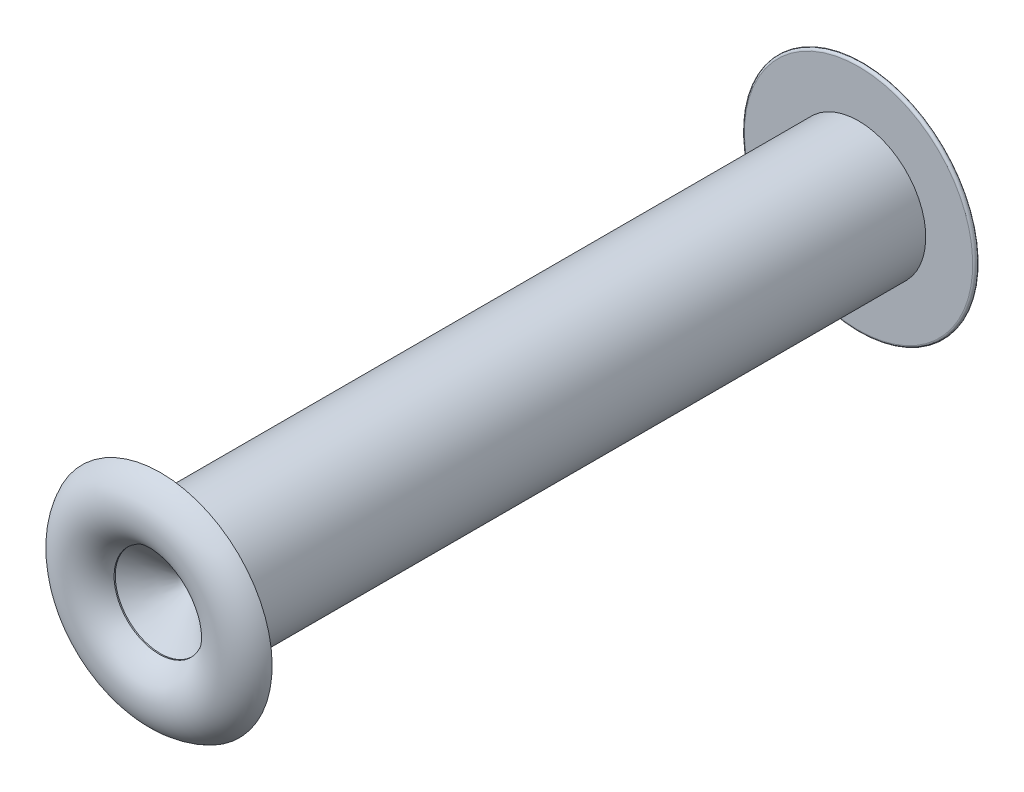
ISO-10303-21;
HEADER;
FILE_DESCRIPTION(('STEP AP214'),'2;1');
FILE_NAME('part.step','',(''),(''),'','','');
FILE_SCHEMA(('AUTOMOTIVE_DESIGN { 1 0 10303 214 1 1 1 1 }'));
ENDSEC;
DATA;
#1=APPLICATION_CONTEXT('core data for automotive mechanical design processes');
#2=APPLICATION_PROTOCOL_DEFINITION('international standard','automotive_design',2000,#1);
#3=PRODUCT_CONTEXT('',#1,'mechanical');
#4=PRODUCT('Part','Part','',(#3));
#5=PRODUCT_RELATED_PRODUCT_CATEGORY('part','',(#4));
#6=PRODUCT_DEFINITION_FORMATION('','',#4);
#7=PRODUCT_DEFINITION_CONTEXT('part definition',#1,'design');
#8=PRODUCT_DEFINITION('design','',#6,#7);
#9=PRODUCT_DEFINITION_SHAPE('','',#8);
#10=(LENGTH_UNIT() NAMED_UNIT(*) SI_UNIT(.MILLI.,.METRE.));
#11=(NAMED_UNIT(*) PLANE_ANGLE_UNIT() SI_UNIT($,.RADIAN.));
#12=(NAMED_UNIT(*) SI_UNIT($,.STERADIAN.) SOLID_ANGLE_UNIT());
#13=UNCERTAINTY_MEASURE_WITH_UNIT(LENGTH_MEASURE(1.E-05),#10,'distance_accuracy_value','');
#14=(GEOMETRIC_REPRESENTATION_CONTEXT(3) GLOBAL_UNCERTAINTY_ASSIGNED_CONTEXT((#13)) GLOBAL_UNIT_ASSIGNED_CONTEXT((#10,
#11,#12)) REPRESENTATION_CONTEXT('',''));
#15=CARTESIAN_POINT('',(0.,0.,0.));
#16=DIRECTION('',(0.,0.,1.));
#17=DIRECTION('',(1.,0.,0.));
#18=AXIS2_PLACEMENT_3D('',#15,#16,#17);
#19=CARTESIAN_POINT('',(12.4968,8.50900000000002,7.98190000102749));
#20=DIRECTION('',(0.,0.,1.));
#21=DIRECTION('',(0.,-1.,0.));
#22=AXIS2_PLACEMENT_3D('',#19,#20,#21);
#23=CONICAL_SURFACE('',#22,1.02452697329119,0.872664624946351);
#24=CARTESIAN_POINT('',(12.4967999999512,8.50900000000365,7.12221979381411));
#25=VERTEX_POINT('',#24);
#26=VERTEX_LOOP('',#25);
#27=FACE_BOUND('',#26,.T.);
#28=CARTESIAN_POINT('',(12.4968,8.50900000000002,7.98190000000431));
#29=DIRECTION('',(0.,0.,1.));
#30=DIRECTION('',(0.503184724324304,-0.864178878014659,0.));
#31=AXIS2_PLACEMENT_3D('',#28,#29,#30);
#32=CIRCLE('',#31,1.02452697414936);
#33=CARTESIAN_POINT('',(13.0123263230502,7.62362542898387,7.98190000000432));
#34=VERTEX_POINT('',#33);
#35=EDGE_CURVE('E33',#34,#34,#32,.T.);
#36=ORIENTED_EDGE('',*,*,#35,.T.);
#37=EDGE_LOOP('',(#36));
#38=FACE_BOUND('',#37,.T.);
#39=ADVANCED_FACE('F17',(#27,#38),#23,.F.);
#40=CARTESIAN_POINT('',(12.4968,8.50900000000002,8.0072999998606));
#41=DIRECTION('',(0.,0.,1.));
#42=DIRECTION('',(0.,-1.,0.));
#43=AXIS2_PLACEMENT_3D('',#40,#41,#42);
#44=CONICAL_SURFACE('',#43,1.02585813173476,0.052359877521599);
#45=ORIENTED_EDGE('',*,*,#35,.F.);
#46=EDGE_LOOP('',(#45));
#47=FACE_BOUND('',#46,.T.);
#48=CARTESIAN_POINT('',(12.4968,8.50900000000002,8.00730000000094));
#49=DIRECTION('',(0.,0.,-1.));
#50=DIRECTION('',(-0.503184724324108,0.864178878014773,0.));
#51=AXIS2_PLACEMENT_3D('',#48,#49,#50);
#52=CIRCLE('',#51,1.02585813174655);
#53=CARTESIAN_POINT('',(11.9806038587815,9.39552492929508,8.00730000000093));
#54=VERTEX_POINT('',#53);
#55=EDGE_CURVE('E35',#54,#54,#52,.T.);
#56=ORIENTED_EDGE('',*,*,#55,.F.);
#57=EDGE_LOOP('',(#56));
#58=FACE_BOUND('',#57,.T.);
#59=ADVANCED_FACE('F30',(#47,#58),#44,.F.);
#60=CARTESIAN_POINT('',(12.4968,8.50899999999999,-3.92659705882259));
#61=DIRECTION('',(-0.864178878014773,-0.503184724324108,0.));
#62=DIRECTION('',(-0.503184724324108,0.864178878014773,0.));
#63=AXIS2_PLACEMENT_3D('',#60,#61,#62);
#64=SPHERICAL_SURFACE('',#63,4.86970294117647);
#65=CARTESIAN_POINT('',(12.4968,8.50899999999997,-8.02626713432975));
#66=DIRECTION('',(0.,0.,-1.));
#67=DIRECTION('',(-0.503184724324108,0.864178878014773,0.));
#68=AXIS2_PLACEMENT_3D('',#65,#66,#67);
#69=CIRCLE('',#68,2.6280624055174);
#70=CARTESIAN_POINT('',(11.1743991429732,10.7801160209528,-8.02626713432976));
#71=VERTEX_POINT('',#70);
#72=EDGE_CURVE('E20',#71,#71,#69,.F.);
#73=ORIENTED_EDGE('',*,*,#72,.F.);
#74=EDGE_LOOP('',(#73));
#75=FACE_BOUND('',#74,.T.);
#76=ADVANCED_FACE('F60',(#75),#64,.T.);
#77=CARTESIAN_POINT('',(12.4968,8.50900000000002,7.62841744712827));
#78=DIRECTION('',(0.,0.,-1.));
#79=DIRECTION('',(-0.503184724324108,0.864178878014773,0.));
#80=AXIS2_PLACEMENT_3D('',#77,#78,#79);
#81=TOROIDAL_SURFACE('',#80,1.77446496492317,0.839025732352735);
#82=ORIENTED_EDGE('',*,*,#55,.T.);
#83=EDGE_LOOP('',(#82));
#84=FACE_BOUND('',#83,.T.);
#85=CARTESIAN_POINT('',(12.4968,8.50900000000002,7.97181268533049));
#86=DIRECTION('',(0.,0.,-1.));
#87=DIRECTION('',(0.,1.,0.));
#88=AXIS2_PLACEMENT_3D('',#85,#86,#87);
#89=CIRCLE('',#88,2.54);
#90=CARTESIAN_POINT('',(12.4968,11.049,7.97181268533048));
#91=VERTEX_POINT('',#90);
#92=EDGE_CURVE('E50',#91,#91,#89,.F.);
#93=ORIENTED_EDGE('',*,*,#92,.T.);
#94=EDGE_LOOP('',(#93));
#95=FACE_BOUND('',#94,.T.);
#96=ADVANCED_FACE('F62',(#84,#95),#81,.T.);
#97=CARTESIAN_POINT('',(12.4968,8.50899999999997,-7.98349999999906));
#98=DIRECTION('',(0.,0.,-1.));
#99=DIRECTION('',(-0.503184724324108,0.864178878014773,0.));
#100=AXIS2_PLACEMENT_3D('',#97,#98,#99);
#101=TOROIDAL_SURFACE('',#100,2.60064685844752,0.0508);
#102=CARTESIAN_POINT('',(12.4968,8.50899999999997,-7.93269999999906));
#103=DIRECTION('',(0.,0.,-1.));
#104=DIRECTION('',(-0.503184724324108,0.864178878014773,0.));
#105=AXIS2_PLACEMENT_3D('',#102,#103,#104);
#106=CIRCLE('',#105,2.60064685844754);
#107=CARTESIAN_POINT('',(11.1881942274677,10.7564240842458,-7.93269999999907));
#108=VERTEX_POINT('',#107);
#109=EDGE_CURVE('E49',#108,#108,#106,.T.);
#110=ORIENTED_EDGE('',*,*,#109,.T.);
#111=EDGE_LOOP('',(#110));
#112=FACE_BOUND('',#111,.T.);
#113=ORIENTED_EDGE('',*,*,#72,.T.);
#114=EDGE_LOOP('',(#113));
#115=FACE_BOUND('',#114,.T.);
#116=ADVANCED_FACE('F58',(#112,#115),#101,.T.);
#117=CARTESIAN_POINT('',(14.2825359042659,9.54877897581566,7.97181268533049));
#118=DIRECTION('',(0.,0.,1.));
#119=DIRECTION('',(0.,-1.,0.));
#120=AXIS2_PLACEMENT_3D('',#117,#118,#119);
#121=PLANE('',#120);
#122=ORIENTED_EDGE('',*,*,#92,.F.);
#123=EDGE_LOOP('',(#122));
#124=FACE_BOUND('',#123,.T.);
#125=CARTESIAN_POINT('',(12.4968,8.50900000000002,7.97181268533049));
#126=DIRECTION('',(0.,0.,-1.));
#127=DIRECTION('',(0.,1.,0.));
#128=AXIS2_PLACEMENT_3D('',#125,#126,#127);
#129=CIRCLE('',#128,2.06639614748302);
#130=CARTESIAN_POINT('',(12.4968,10.575396147483,7.97181268533048));
#131=VERTEX_POINT('',#130);
#132=EDGE_CURVE('E47',#131,#131,#129,.F.);
#133=ORIENTED_EDGE('',*,*,#132,.T.);
#134=EDGE_LOOP('',(#133));
#135=FACE_BOUND('',#134,.T.);
#136=ADVANCED_FACE('F108',(#124,#135),#121,.F.);
#137=CARTESIAN_POINT('',(11.1743038540301,7.73895125713057,-7.93269999999906));
#138=DIRECTION('',(0.,0.,-1.));
#139=DIRECTION('',(0.,1.,0.));
#140=AXIS2_PLACEMENT_3D('',#137,#138,#139);
#141=PLANE('',#140);
#142=CARTESIAN_POINT('',(12.4968,8.50899999999997,-7.93269999999906));
#143=DIRECTION('',(0.,0.,-1.));
#144=DIRECTION('',(0.,1.,0.));
#145=AXIS2_PLACEMENT_3D('',#142,#143,#144);
#146=CIRCLE('',#145,1.53035);
#147=CARTESIAN_POINT('',(12.4968,10.03935,-7.93269999999907));
#148=VERTEX_POINT('',#147);
#149=EDGE_CURVE('E24',#148,#148,#146,.F.);
#150=ORIENTED_EDGE('',*,*,#149,.F.);
#151=EDGE_LOOP('',(#150));
#152=FACE_BOUND('',#151,.T.);
#153=ORIENTED_EDGE('',*,*,#109,.F.);
#154=EDGE_LOOP('',(#153));
#155=FACE_BOUND('',#154,.T.);
#156=ADVANCED_FACE('F79',(#152,#155),#141,.F.);
#157=CARTESIAN_POINT('',(12.4968,8.50900000000002,7.62841744712827));
#158=DIRECTION('',(0.,0.,-1.));
#159=DIRECTION('',(-0.503184724324108,0.864178878014773,0.));
#160=AXIS2_PLACEMENT_3D('',#157,#158,#159);
#161=TOROIDAL_SURFACE('',#160,1.77446496492317,0.450715103996694);
#162=ORIENTED_EDGE('',*,*,#132,.F.);
#163=EDGE_LOOP('',(#162));
#164=FACE_BOUND('',#163,.T.);
#165=CARTESIAN_POINT('',(12.4968,8.50900000000002,8.00730000000094));
#166=DIRECTION('',(0.,0.,-1.));
#167=DIRECTION('',(0.,1.,0.));
#168=AXIS2_PLACEMENT_3D('',#165,#166,#167);
#169=CIRCLE('',#168,1.53035);
#170=CARTESIAN_POINT('',(12.4968,10.03935,8.00730000000093));
#171=VERTEX_POINT('',#170);
#172=EDGE_CURVE('E11',#171,#171,#169,.T.);
#173=ORIENTED_EDGE('',*,*,#172,.F.);
#174=EDGE_LOOP('',(#173));
#175=FACE_BOUND('',#174,.T.);
#176=ADVANCED_FACE('F73',(#164,#175),#161,.F.);
#177=CARTESIAN_POINT('',(12.4968,8.50899999999997,-8.49629999999906));
#178=DIRECTION('',(0.,0.,-1.));
#179=DIRECTION('',(0.,1.,0.));
#180=AXIS2_PLACEMENT_3D('',#177,#178,#179);
#181=CYLINDRICAL_SURFACE('',#180,1.53035);
#182=ORIENTED_EDGE('',*,*,#172,.T.);
#183=EDGE_LOOP('',(#182));
#184=FACE_BOUND('',#183,.T.);
#185=ORIENTED_EDGE('',*,*,#149,.T.);
#186=EDGE_LOOP('',(#185));
#187=FACE_BOUND('',#186,.T.);
#188=ADVANCED_FACE('F71',(#184,#187),#181,.T.);
#189=CLOSED_SHELL('',(#39,#59,#76,#96,#116,#136,#156,#176,#188));
#190=MANIFOLD_SOLID_BREP('B1',#189);
#191=ADVANCED_BREP_SHAPE_REPRESENTATION('',(#18,#190),#14);
#192=SHAPE_DEFINITION_REPRESENTATION(#9,#191);
ENDSEC;
END-ISO-10303-21;
